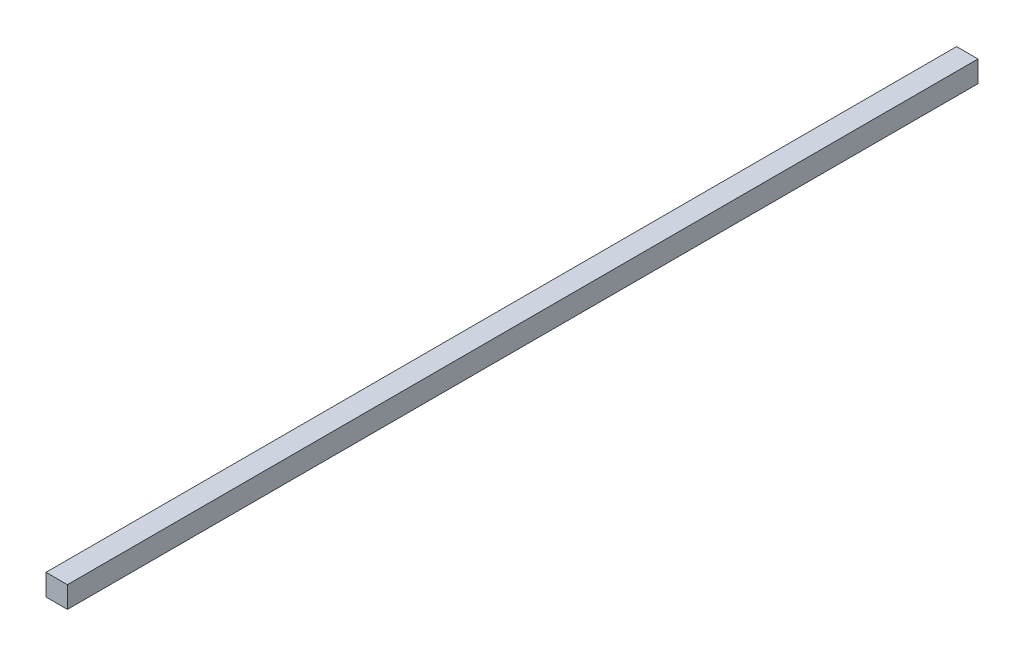
ISO-10303-21;
HEADER;
FILE_DESCRIPTION(('STEP AP214'),'2;1');
FILE_NAME('part.step','',(''),(''),'','','');
FILE_SCHEMA(('AUTOMOTIVE_DESIGN { 1 0 10303 214 1 1 1 1 }'));
ENDSEC;
DATA;
#1=APPLICATION_CONTEXT('core data for automotive mechanical design processes');
#2=APPLICATION_PROTOCOL_DEFINITION('international standard','automotive_design',2000,#1);
#3=PRODUCT_CONTEXT('',#1,'mechanical');
#4=PRODUCT('Part','Part','',(#3));
#5=PRODUCT_RELATED_PRODUCT_CATEGORY('part','',(#4));
#6=PRODUCT_DEFINITION_FORMATION('','',#4);
#7=PRODUCT_DEFINITION_CONTEXT('part definition',#1,'design');
#8=PRODUCT_DEFINITION('design','',#6,#7);
#9=PRODUCT_DEFINITION_SHAPE('','',#8);
#10=(LENGTH_UNIT() NAMED_UNIT(*) SI_UNIT(.MILLI.,.METRE.));
#11=(NAMED_UNIT(*) PLANE_ANGLE_UNIT() SI_UNIT($,.RADIAN.));
#12=(NAMED_UNIT(*) SI_UNIT($,.STERADIAN.) SOLID_ANGLE_UNIT());
#13=UNCERTAINTY_MEASURE_WITH_UNIT(LENGTH_MEASURE(1.E-05),#10,'distance_accuracy_value','');
#14=(GEOMETRIC_REPRESENTATION_CONTEXT(3) GLOBAL_UNCERTAINTY_ASSIGNED_CONTEXT((#13)) GLOBAL_UNIT_ASSIGNED_CONTEXT((#10,
#11,#12)) REPRESENTATION_CONTEXT('',''));
#15=CARTESIAN_POINT('',(0.,0.,0.));
#16=DIRECTION('',(0.,0.,1.));
#17=DIRECTION('',(1.,0.,0.));
#18=AXIS2_PLACEMENT_3D('',#15,#16,#17);
#19=CARTESIAN_POINT('',(-3.,-3.,127.5));
#20=DIRECTION('',(1.,0.,0.));
#21=DIRECTION('',(0.,1.,0.));
#22=AXIS2_PLACEMENT_3D('',#19,#20,#21);
#23=PLANE('',#22);
#24=DIRECTION('',(0.,-1.,0.));
#25=VECTOR('',#24,1.);
#26=CARTESIAN_POINT('',(-3.,-3.,-127.5));
#27=LINE('',#26,#25);
#28=CARTESIAN_POINT('',(-3.,3.,-127.5));
#29=VERTEX_POINT('',#28);
#30=CARTESIAN_POINT('',(-3.,-3.,-127.5));
#31=VERTEX_POINT('',#30);
#32=EDGE_CURVE('E109',#29,#31,#27,.T.);
#33=ORIENTED_EDGE('',*,*,#32,.T.);
#34=DIRECTION('',(0.,0.,-1.));
#35=VECTOR('',#34,1.);
#36=CARTESIAN_POINT('',(-3.,-3.,127.5));
#37=LINE('',#36,#35);
#38=CARTESIAN_POINT('',(-3.,-3.,127.5));
#39=VERTEX_POINT('',#38);
#40=EDGE_CURVE('E11',#39,#31,#37,.T.);
#41=ORIENTED_EDGE('',*,*,#40,.F.);
#42=DIRECTION('',(0.,-1.,0.));
#43=VECTOR('',#42,1.);
#44=CARTESIAN_POINT('',(-3.,-3.,127.5));
#45=LINE('',#44,#43);
#46=CARTESIAN_POINT('',(-3.,3.,127.5));
#47=VERTEX_POINT('',#46);
#48=EDGE_CURVE('E93',#47,#39,#45,.T.);
#49=ORIENTED_EDGE('',*,*,#48,.F.);
#50=DIRECTION('',(0.,0.,-1.));
#51=VECTOR('',#50,1.);
#52=CARTESIAN_POINT('',(-3.,3.,127.5));
#53=LINE('',#52,#51);
#54=EDGE_CURVE('E105',#47,#29,#53,.T.);
#55=ORIENTED_EDGE('',*,*,#54,.T.);
#56=EDGE_LOOP('',(#33,#41,#49,#55));
#57=FACE_BOUND('',#56,.T.);
#58=ADVANCED_FACE('F41',(#57),#23,.F.);
#59=CARTESIAN_POINT('',(3.,-3.,127.5));
#60=DIRECTION('',(0.,1.,0.));
#61=DIRECTION('',(-1.,0.,0.));
#62=AXIS2_PLACEMENT_3D('',#59,#60,#61);
#63=PLANE('',#62);
#64=DIRECTION('',(1.,0.,0.));
#65=VECTOR('',#64,1.);
#66=CARTESIAN_POINT('',(3.,-3.,-127.5));
#67=LINE('',#66,#65);
#68=CARTESIAN_POINT('',(3.,-3.,-127.5));
#69=VERTEX_POINT('',#68);
#70=EDGE_CURVE('E98',#31,#69,#67,.T.);
#71=ORIENTED_EDGE('',*,*,#70,.T.);
#72=DIRECTION('',(0.,0.,-1.));
#73=VECTOR('',#72,1.);
#74=CARTESIAN_POINT('',(3.,-3.,127.5));
#75=LINE('',#74,#73);
#76=CARTESIAN_POINT('',(3.,-3.,127.5));
#77=VERTEX_POINT('',#76);
#78=EDGE_CURVE('E50',#77,#69,#75,.T.);
#79=ORIENTED_EDGE('',*,*,#78,.F.);
#80=DIRECTION('',(1.,0.,0.));
#81=VECTOR('',#80,1.);
#82=CARTESIAN_POINT('',(3.,-3.,127.5));
#83=LINE('',#82,#81);
#84=EDGE_CURVE('E88',#39,#77,#83,.T.);
#85=ORIENTED_EDGE('',*,*,#84,.F.);
#86=ORIENTED_EDGE('',*,*,#40,.T.);
#87=EDGE_LOOP('',(#71,#79,#85,#86));
#88=FACE_BOUND('',#87,.T.);
#89=ADVANCED_FACE('F97',(#88),#63,.F.);
#90=CARTESIAN_POINT('',(3.,3.,127.5));
#91=DIRECTION('',(-1.,0.,0.));
#92=DIRECTION('',(0.,-1.,0.));
#93=AXIS2_PLACEMENT_3D('',#90,#91,#92);
#94=PLANE('',#93);
#95=DIRECTION('',(0.,1.,0.));
#96=VECTOR('',#95,1.);
#97=CARTESIAN_POINT('',(3.,3.,-127.5));
#98=LINE('',#97,#96);
#99=CARTESIAN_POINT('',(3.,3.,-127.5));
#100=VERTEX_POINT('',#99);
#101=EDGE_CURVE('E75',#69,#100,#98,.T.);
#102=ORIENTED_EDGE('',*,*,#101,.T.);
#103=DIRECTION('',(0.,0.,-1.));
#104=VECTOR('',#103,1.);
#105=CARTESIAN_POINT('',(3.,3.,127.5));
#106=LINE('',#105,#104);
#107=CARTESIAN_POINT('',(3.,3.,127.5));
#108=VERTEX_POINT('',#107);
#109=EDGE_CURVE('E100',#108,#100,#106,.T.);
#110=ORIENTED_EDGE('',*,*,#109,.F.);
#111=DIRECTION('',(0.,1.,0.));
#112=VECTOR('',#111,1.);
#113=CARTESIAN_POINT('',(3.,3.,127.5));
#114=LINE('',#113,#112);
#115=EDGE_CURVE('E91',#77,#108,#114,.T.);
#116=ORIENTED_EDGE('',*,*,#115,.F.);
#117=ORIENTED_EDGE('',*,*,#78,.T.);
#118=EDGE_LOOP('',(#102,#110,#116,#117));
#119=FACE_BOUND('',#118,.T.);
#120=ADVANCED_FACE('F101',(#119),#94,.F.);
#121=CARTESIAN_POINT('',(-3.,3.,127.5));
#122=DIRECTION('',(0.,-1.,0.));
#123=DIRECTION('',(1.,0.,0.));
#124=AXIS2_PLACEMENT_3D('',#121,#122,#123);
#125=PLANE('',#124);
#126=DIRECTION('',(-1.,0.,0.));
#127=VECTOR('',#126,1.);
#128=CARTESIAN_POINT('',(-3.,3.,-127.5));
#129=LINE('',#128,#127);
#130=EDGE_CURVE('E81',#100,#29,#129,.T.);
#131=ORIENTED_EDGE('',*,*,#130,.T.);
#132=ORIENTED_EDGE('',*,*,#54,.F.);
#133=DIRECTION('',(-1.,0.,0.));
#134=VECTOR('',#133,1.);
#135=CARTESIAN_POINT('',(-3.,3.,127.5));
#136=LINE('',#135,#134);
#137=EDGE_CURVE('E58',#108,#47,#136,.T.);
#138=ORIENTED_EDGE('',*,*,#137,.F.);
#139=ORIENTED_EDGE('',*,*,#109,.T.);
#140=EDGE_LOOP('',(#131,#132,#138,#139));
#141=FACE_BOUND('',#140,.T.);
#142=ADVANCED_FACE('F122',(#141),#125,.F.);
#143=CARTESIAN_POINT('',(0.,0.,127.5));
#144=DIRECTION('',(0.,0.,-1.));
#145=DIRECTION('',(-1.,0.,0.));
#146=AXIS2_PLACEMENT_3D('',#143,#144,#145);
#147=PLANE('',#146);
#148=ORIENTED_EDGE('',*,*,#48,.T.);
#149=ORIENTED_EDGE('',*,*,#84,.T.);
#150=ORIENTED_EDGE('',*,*,#115,.T.);
#151=ORIENTED_EDGE('',*,*,#137,.T.);
#152=EDGE_LOOP('',(#148,#149,#150,#151));
#153=FACE_BOUND('',#152,.T.);
#154=ADVANCED_FACE('F89',(#153),#147,.F.);
#155=CARTESIAN_POINT('',(0.,0.,-127.5));
#156=DIRECTION('',(0.,0.,-1.));
#157=DIRECTION('',(-1.,0.,0.));
#158=AXIS2_PLACEMENT_3D('',#155,#156,#157);
#159=PLANE('',#158);
#160=ORIENTED_EDGE('',*,*,#32,.F.);
#161=ORIENTED_EDGE('',*,*,#130,.F.);
#162=ORIENTED_EDGE('',*,*,#101,.F.);
#163=ORIENTED_EDGE('',*,*,#70,.F.);
#164=EDGE_LOOP('',(#160,#161,#162,#163));
#165=FACE_BOUND('',#164,.T.);
#166=ADVANCED_FACE('F125',(#165),#159,.T.);
#167=CLOSED_SHELL('',(#58,#89,#120,#142,#154,#166));
#168=MANIFOLD_SOLID_BREP('B2',#167);
#169=ADVANCED_BREP_SHAPE_REPRESENTATION('',(#18,#168),#14);
#170=SHAPE_DEFINITION_REPRESENTATION(#9,#169);
ENDSEC;
END-ISO-10303-21;
